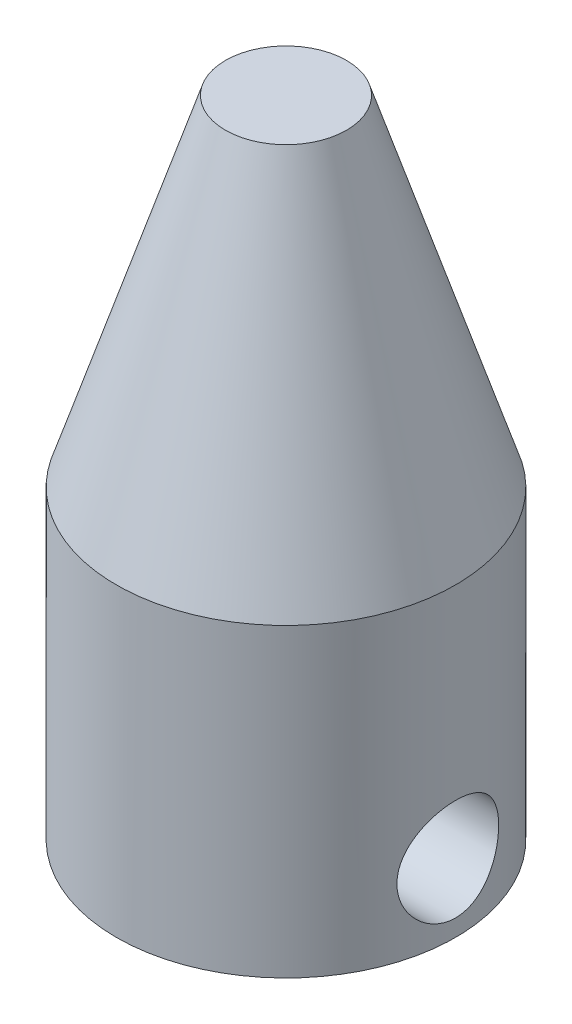
ISO-10303-21;
HEADER;
FILE_DESCRIPTION(('STEP AP214'),'2;1');
FILE_NAME('part.step','',(''),(''),'','','');
FILE_SCHEMA(('AUTOMOTIVE_DESIGN { 1 0 10303 214 1 1 1 1 }'));
ENDSEC;
DATA;
#1=APPLICATION_CONTEXT('core data for automotive mechanical design processes');
#2=APPLICATION_PROTOCOL_DEFINITION('international standard','automotive_design',2000,#1);
#3=PRODUCT_CONTEXT('',#1,'mechanical');
#4=PRODUCT('Part','Part','',(#3));
#5=PRODUCT_RELATED_PRODUCT_CATEGORY('part','',(#4));
#6=PRODUCT_DEFINITION_FORMATION('','',#4);
#7=PRODUCT_DEFINITION_CONTEXT('part definition',#1,'design');
#8=PRODUCT_DEFINITION('design','',#6,#7);
#9=PRODUCT_DEFINITION_SHAPE('','',#8);
#10=(LENGTH_UNIT() NAMED_UNIT(*) SI_UNIT(.MILLI.,.METRE.));
#11=(NAMED_UNIT(*) PLANE_ANGLE_UNIT() SI_UNIT($,.RADIAN.));
#12=(NAMED_UNIT(*) SI_UNIT($,.STERADIAN.) SOLID_ANGLE_UNIT());
#13=UNCERTAINTY_MEASURE_WITH_UNIT(LENGTH_MEASURE(1.E-05),#10,'distance_accuracy_value','');
#14=(GEOMETRIC_REPRESENTATION_CONTEXT(3) GLOBAL_UNCERTAINTY_ASSIGNED_CONTEXT((#13)) GLOBAL_UNIT_ASSIGNED_CONTEXT((#10,
#11,#12)) REPRESENTATION_CONTEXT('',''));
#15=CARTESIAN_POINT('',(0.,0.,0.));
#16=DIRECTION('',(0.,0.,1.));
#17=DIRECTION('',(1.,0.,0.));
#18=AXIS2_PLACEMENT_3D('',#15,#16,#17);
#19=CARTESIAN_POINT('',(0.,9.,0.));
#20=DIRECTION('',(0.,-1.,0.));
#21=DIRECTION('',(0.,0.,-1.));
#22=AXIS2_PLACEMENT_3D('',#19,#20,#21);
#23=CYLINDRICAL_SURFACE('',#22,5.);
#24=CARTESIAN_POINT('',(-5.,0.5,0.));
#25=CARTESIAN_POINT('',(-4.9999992925055,0.500000997484886,-0.0822886127533));
#26=CARTESIAN_POINT('',(-4.99794915693954,0.506793863623966,-0.164587318351529));
#27=CARTESIAN_POINT('',(-4.98997105593691,0.533721354222101,-0.326788125304881));
#28=CARTESIAN_POINT('',(-4.98404193389692,0.553859958023342,-0.40668950441142));
#29=CARTESIAN_POINT('',(-4.96895552501836,0.606746016910264,-0.561732707754527));
#30=CARTESIAN_POINT('',(-4.95980300250425,0.639474869618937,-0.636881364395373));
#31=CARTESIAN_POINT('',(-4.93922109237645,0.716536093055836,-0.780624181053131));
#32=CARTESIAN_POINT('',(-4.92779140192067,0.760870007395417,-0.84921746746967));
#33=CARTESIAN_POINT('',(-4.90350737192774,0.861224007472669,-0.979871797183745));
#34=CARTESIAN_POINT('',(-4.89062383657036,0.917516625885914,-1.04171807124434));
#35=CARTESIAN_POINT('',(-4.86505834210442,1.03960922991018,-1.15524920923324));
#36=CARTESIAN_POINT('',(-4.85237641724501,1.10541081212496,-1.20693236327441));
#37=CARTESIAN_POINT('',(-4.82834113993772,1.24647075303761,-1.29980037723708));
#38=CARTESIAN_POINT('',(-4.81702406663875,1.32190846099074,-1.34072309022213));
#39=CARTESIAN_POINT('',(-4.79743620394031,1.47898925423029,-1.4092139477476));
#40=CARTESIAN_POINT('',(-4.78916468313311,1.56063084392798,-1.43678529919973));
#41=CARTESIAN_POINT('',(-4.77690870838434,1.72539026613046,-1.47701633682652));
#42=CARTESIAN_POINT('',(-4.77281069324533,1.80840274386394,-1.49007196234677));
#43=CARTESIAN_POINT('',(-4.76902789749767,1.97553315621677,-1.50213730614672));
#44=CARTESIAN_POINT('',(-4.76934204760571,2.05965081805909,-1.50115042761078));
#45=CARTESIAN_POINT('',(-4.77424744067778,2.22338390860848,-1.48546977199812));
#46=CARTESIAN_POINT('',(-4.7786838859914,2.30305225036224,-1.47127205262685));
#47=CARTESIAN_POINT('',(-4.79108356228624,2.45881978627346,-1.43037420427056));
#48=CARTESIAN_POINT('',(-4.79904714132351,2.53491862737433,-1.40367284141641));
#49=CARTESIAN_POINT('',(-4.81772733074973,2.68260034966074,-1.33816026653682));
#50=CARTESIAN_POINT('',(-4.82848016115952,2.75410708395526,-1.29918816934642));
#51=CARTESIAN_POINT('',(-4.85150987000065,2.88973202201019,-1.21035222588683));
#52=CARTESIAN_POINT('',(-4.86378711746991,2.95384842941378,-1.16048574002588));
#53=CARTESIAN_POINT('',(-4.88911011297937,3.07568619076202,-1.04881290765546));
#54=CARTESIAN_POINT('',(-4.90216654310498,3.13302866402967,-0.986594907466972));
#55=CARTESIAN_POINT('',(-4.92712244063259,3.23655398406425,-0.853263259313967));
#56=CARTESIAN_POINT('',(-4.9390218351841,3.28273612841443,-0.782149051860888));
#57=CARTESIAN_POINT('',(-4.9604316006947,3.36285992246473,-0.632355038342803));
#58=CARTESIAN_POINT('',(-4.96992543668314,3.39671751624986,-0.55362774974795));
#59=CARTESIAN_POINT('',(-4.98533521832222,3.45059959009963,-0.39124541560352));
#60=CARTESIAN_POINT('',(-4.99125216186999,3.47062792853249,-0.307591751589582));
#61=CARTESIAN_POINT('',(-4.99868364643538,3.49565217789939,-0.140952242668332));
#62=CARTESIAN_POINT('',(-5.0003485041779,3.50116158580161,-0.0580500976011871));
#63=CARTESIAN_POINT('',(-4.9995292324176,3.49843084428792,0.107499605823383));
#64=CARTESIAN_POINT('',(-4.99704565677756,3.49019253034856,0.19014719669078));
#65=CARTESIAN_POINT('',(-4.98830696987163,3.4606153888885,0.350903605309697));
#66=CARTESIAN_POINT('',(-4.98213829799417,3.43957661241913,0.429072772614169));
#67=CARTESIAN_POINT('',(-4.96674347841533,3.3853567672218,0.580754638954522));
#68=CARTESIAN_POINT('',(-4.95751696321085,3.35217423896214,0.654266777025583));
#69=CARTESIAN_POINT('',(-4.93669654351325,3.27374683451887,0.796437189461052));
#70=CARTESIAN_POINT('',(-4.92505280829675,3.22824065905203,0.864943826199669));
#71=CARTESIAN_POINT('',(-4.90073468764318,3.12677524594719,0.993523307980147));
#72=CARTESIAN_POINT('',(-4.8880600443108,3.07081338811233,1.05359403235593));
#73=CARTESIAN_POINT('',(-4.86253171869138,2.94761269163066,1.16585744551027));
#74=CARTESIAN_POINT('',(-4.84968825033268,2.88003812422826,1.21768481231503));
#75=CARTESIAN_POINT('',(-4.82576515238464,2.73687206098647,1.30928995072154));
#76=CARTESIAN_POINT('',(-4.81468547654651,2.66128077544179,1.34906803829472));
#77=CARTESIAN_POINT('',(-4.79567189615055,2.50446750874531,1.41517347127168));
#78=CARTESIAN_POINT('',(-4.78772337843827,2.42327381346341,1.4415634693705));
#79=CARTESIAN_POINT('',(-4.77591594362794,2.25731203106852,1.48021730815114));
#80=CARTESIAN_POINT('',(-4.772055625083,2.17254517921233,1.49248598978779));
#81=CARTESIAN_POINT('',(-4.76899972496087,2.00563848162377,1.50221984485059));
#82=CARTESIAN_POINT('',(-4.76961647442754,1.92353634898242,1.5002805530849));
#83=CARTESIAN_POINT('',(-4.77499401288294,1.7608858966272,1.48307505444813));
#84=CARTESIAN_POINT('',(-4.77975463592551,1.68033751482365,1.46780938124716));
#85=CARTESIAN_POINT('',(-4.79275763670385,1.52405460085715,1.42476888804136));
#86=CARTESIAN_POINT('',(-4.80095604545965,1.44827271263831,1.39715175507068));
#87=CARTESIAN_POINT('',(-4.81990278909136,1.30235756118228,1.33031507121129));
#88=CARTESIAN_POINT('',(-4.83065161194312,1.23222538235924,1.29109329962876));
#89=CARTESIAN_POINT('',(-4.85397676425833,1.09683688347289,1.20048763805072));
#90=CARTESIAN_POINT('',(-4.86660540163798,1.03185123873959,1.14871276092994));
#91=CARTESIAN_POINT('',(-4.89201320450026,0.911297501692137,1.03517434629782));
#92=CARTESIAN_POINT('',(-4.90479240823905,0.855731860532243,0.973408217134502));
#93=CARTESIAN_POINT('',(-4.92950936570649,0.75397658770497,0.839465762183249));
#94=CARTESIAN_POINT('',(-4.94141159765674,0.708108553144511,0.767037885790608));
#95=CARTESIAN_POINT('',(-4.96260680455813,0.629264830095975,0.615141373983529));
#96=CARTESIAN_POINT('',(-4.97190099931067,0.596283111725492,0.535676052998955));
#97=CARTESIAN_POINT('',(-4.98602174969301,0.547104724347251,0.380757712655282));
#98=CARTESIAN_POINT('',(-4.99122027381068,0.529488327116752,0.305786961954234));
#99=CARTESIAN_POINT('',(-4.99820944494492,0.505936474758423,0.15388019523078));
#100=CARTESIAN_POINT('',(-5.0000006615474,0.499999067295181,0.0769445098581397));
#101=CARTESIAN_POINT('',(-5.,0.5,0.));
#102=B_SPLINE_CURVE_WITH_KNOTS('',3,(#24,#25,#26,#27,#28,#29,#30,#31,#32,#33,#34,#35,#36,#37,
#38,#39,#40,#41,#42,#43,#44,#45,#46,#47,#48,#49,#50,#51,#52,#53,#54,#55,#56,#57,#58,#59,#60,#61,
#62,#63,#64,#65,#66,#67,#68,#69,#70,#71,#72,#73,#74,#75,#76,#77,#78,#79,#80,#81,#82,#83,#84,#85,
#86,#87,#88,#89,#90,#91,#92,#93,#94,#95,#96,#97,#98,#99,#100,#101),.UNSPECIFIED.,.T.,.F.,(4,2,2,
2,2,2,2,2,2,2,2,2,2,2,2,2,2,2,2,2,2,2,2,2,2,2,2,2,2,2,2,2,2,2,2,2,2,2,4),(0.,0.246583203612611,
0.493239964846,0.739533676300874,0.985860164412702,1.23855602948191,1.49129437288633,
1.74971481004109,2.00807314543224,2.25919689356599,2.51025978319089,2.75226016697676,
2.99428443658001,3.23962426447119,3.48502360158555,3.74067104048166,3.99633456531071,
4.25371046881688,4.51101453528808,4.75908809438545,5.00712853550327,5.24956746682327,
5.49203554593728,5.74011305702908,5.98825282000191,6.24540400322818,6.5025484425268,
6.75847814951252,7.01432009460283,7.25950155466943,7.504673196616,7.74680040402721,
7.98897397553107,8.23996925679931,8.49102974897502,8.74942996156671,9.00770911595235,
9.23831691930459,9.46888616948874),.UNSPECIFIED.);
#103=CARTESIAN_POINT('',(-5.,0.5,0.));
#104=VERTEX_POINT('',#103);
#105=EDGE_CURVE('E11',#104,#104,#102,.T.);
#106=ORIENTED_EDGE('',*,*,#105,.T.);
#107=EDGE_LOOP('',(#106));
#108=FACE_BOUND('',#107,.T.);
#109=CARTESIAN_POINT('',(4.76969600708473,2.,-1.5));
#110=CARTESIAN_POINT('',(4.7696968572698,1.9178054520576,-1.49999897633764));
#111=CARTESIAN_POINT('',(4.77184390209069,1.83560077585598,-1.49322108167142));
#112=CARTESIAN_POINT('',(4.780165783029,1.67359475040806,-1.46635844446749));
#113=CARTESIAN_POINT('',(4.78634196493468,1.59379421349853,-1.44626925573578));
#114=CARTESIAN_POINT('',(4.80196102485632,1.43896527172827,-1.39352753269955));
#115=CARTESIAN_POINT('',(4.81139846703232,1.36392917036691,-1.36089589394243));
#116=CARTESIAN_POINT('',(4.83246932547567,1.2203780660047,-1.28406421917929));
#117=CARTESIAN_POINT('',(4.84410307041019,1.15186404131556,-1.23986245137053));
#118=CARTESIAN_POINT('',(4.86866862185765,1.02113360942262,-1.13964754141627));
#119=CARTESIAN_POINT('',(4.88162808311636,0.959154102053713,-1.08333207175807));
#120=CARTESIAN_POINT('',(4.90714861936757,0.845362048677491,-0.961136237579599));
#121=CARTESIAN_POINT('',(4.91970964297705,0.793550809550121,-0.895254645461111));
#122=CARTESIAN_POINT('',(4.94333214579389,0.700537300166693,-0.75411143779369));
#123=CARTESIAN_POINT('',(4.95435724342404,0.659576575557191,-0.678684021335815));
#124=CARTESIAN_POINT('',(4.97334435920684,0.591012740957243,-0.521624645369354));
#125=CARTESIAN_POINT('',(4.98130703789495,0.563406750142551,-0.439994028387912));
#126=CARTESIAN_POINT('',(4.99307646003589,0.523119998909491,-0.27532385263083));
#127=CARTESIAN_POINT('',(4.99699557369338,0.510034872347297,-0.192391398953801));
#128=CARTESIAN_POINT('',(5.00063201501348,0.497882675353559,-0.025421823749315));
#129=CARTESIAN_POINT('',(5.00035022521079,0.498812660598037,0.0586150620503682));
#130=CARTESIAN_POINT('',(4.99569603817659,0.514392868543023,0.22257115660016));
#131=CARTESIAN_POINT('',(4.9914542020526,0.528605193809869,0.302536267641341));
#132=CARTESIAN_POINT('',(4.97951522112593,0.56963133599429,0.458889213442527));
#133=CARTESIAN_POINT('',(4.97181785750586,0.596445950942671,0.535276821322846));
#134=CARTESIAN_POINT('',(4.95365220986963,0.662212023418558,0.683347326351281));
#135=CARTESIAN_POINT('',(4.94315269676706,0.701301202807267,0.754965064694478));
#136=CARTESIAN_POINT('',(4.92049640648069,0.790397852428228,0.890764673783156));
#137=CARTESIAN_POINT('',(4.90833923637778,0.840407912963484,0.954944774872131));
#138=CARTESIAN_POINT('',(4.88311550488165,0.952197750751597,1.0766604815298));
#139=CARTESIAN_POINT('',(4.87003195321461,1.01435691902974,1.13384458040111));
#140=CARTESIAN_POINT('',(4.84483979887497,1.14751001789005,1.23707651539824));
#141=CARTESIAN_POINT('',(4.8327312931702,1.21850482538923,1.28312324482853));
#142=CARTESIAN_POINT('',(4.81077903197678,1.36823946924899,1.3631399533545));
#143=CARTESIAN_POINT('',(4.80095810695957,1.44704704586292,1.39698989237679));
#144=CARTESIAN_POINT('',(4.78496392548436,1.60960720844554,1.45083362878413));
#145=CARTESIAN_POINT('',(4.7787894791583,1.69335817153456,1.4708319464056));
#146=CARTESIAN_POINT('',(4.77104849541241,1.86008236073928,1.49574770282165));
#147=CARTESIAN_POINT('',(4.7693187867044,1.94296822389398,1.50119946380212));
#148=CARTESIAN_POINT('',(4.77021192441924,2.10847290000987,1.49835947233062));
#149=CARTESIAN_POINT('',(4.77283416156589,2.19109174873085,1.4900696437133));
#150=CARTESIAN_POINT('',(4.78197558554912,2.35148837797087,1.4604576357419));
#151=CARTESIAN_POINT('',(4.78839176507489,2.42933616426352,1.4394796143128));
#152=CARTESIAN_POINT('',(4.80429141231227,2.58040169081492,1.3854857774794));
#153=CARTESIAN_POINT('',(4.81377535359073,2.65361871414057,1.3524681034276));
#154=CARTESIAN_POINT('',(4.83505835023047,2.79551746407213,1.274318711965));
#155=CARTESIAN_POINT('',(4.84691271069799,2.86402472098579,1.22888564172729));
#156=CARTESIAN_POINT('',(4.87148205646987,2.9926381061808,1.12755301600385));
#157=CARTESIAN_POINT('',(4.88419724730003,3.05274221761279,1.07165095534897));
#158=CARTESIAN_POINT('',(4.90963633548158,3.16518040581474,0.948455132493599));
#159=CARTESIAN_POINT('',(4.92234245063004,3.21713562898698,0.880811065857434));
#160=CARTESIAN_POINT('',(4.94584851748651,3.30896670102775,0.737461784590249));
#161=CARTESIAN_POINT('',(4.95664856384717,3.34884314978146,0.661756970543944));
#162=CARTESIAN_POINT('',(4.97505970474957,3.4150000305683,0.504935504705222));
#163=CARTESIAN_POINT('',(4.98269453424966,3.44138201615898,0.423864622037839));
#164=CARTESIAN_POINT('',(4.99401979596827,3.48006091889042,0.258169966504588));
#165=CARTESIAN_POINT('',(4.9977113567088,3.49236186594842,0.173547217354763));
#166=CARTESIAN_POINT('',(5.00066544081399,3.5022230440545,0.00665215388274265));
#167=CARTESIAN_POINT('',(5.00009305111322,3.50033269540783,-0.0755851790862068));
#168=CARTESIAN_POINT('',(4.99497264465037,3.48317836750088,-0.238519481164404));
#169=CARTESIAN_POINT('',(4.99042485330462,3.46791514651956,-0.319216537346529));
#170=CARTESIAN_POINT('',(4.97791168358327,3.42478833860038,-0.475935813041358));
#171=CARTESIAN_POINT('',(4.96998352900866,3.39706181935099,-0.551998927351392));
#172=CARTESIAN_POINT('',(4.9515294303945,3.32991808549281,-0.698433237752053));
#173=CARTESIAN_POINT('',(4.94100305949946,3.29049894971381,-0.76880349605058));
#174=CARTESIAN_POINT('',(4.91803965828228,3.19962654256996,-0.904301892420563));
#175=CARTESIAN_POINT('',(4.90555226923559,3.14782856999923,-0.969190250076767));
#176=CARTESIAN_POINT('',(4.88023537212334,3.0342896116672,-1.08953757134594));
#177=CARTESIAN_POINT('',(4.86740576641079,2.97254576210185,-1.14499380960194));
#178=CARTESIAN_POINT('',(4.84240680631319,2.83865922168949,-1.24656269394549));
#179=CARTESIAN_POINT('',(4.83026852693485,2.76626144660956,-1.29234759757956));
#180=CARTESIAN_POINT('',(4.80852547508793,2.61444482583898,-1.37104313528776));
#181=CARTESIAN_POINT('',(4.79891948596956,2.53502937639881,-1.40395995557289));
#182=CARTESIAN_POINT('',(4.78427816717594,2.38025956839373,-1.4530194253295));
#183=CARTESIAN_POINT('',(4.7788615484052,2.30539135306901,-1.47058859011232));
#184=CARTESIAN_POINT('',(4.77157042597167,2.15368477750423,-1.49407818835144));
#185=CARTESIAN_POINT('',(4.7696952122143,2.07684681535475,-1.50000095706095));
#186=CARTESIAN_POINT('',(4.76969600708473,2.,-1.5));
#187=B_SPLINE_CURVE_WITH_KNOTS('',3,(#109,#110,#111,#112,#113,#114,#115,#116,#117,#118,#119,
#120,#121,#122,#123,#124,#125,#126,#127,#128,#129,#130,#131,#132,#133,#134,#135,#136,#137,#138,
#139,#140,#141,#142,#143,#144,#145,#146,#147,#148,#149,#150,#151,#152,#153,#154,#155,#156,#157,
#158,#159,#160,#161,#162,#163,#164,#165,#166,#167,#168,#169,#170,#171,#172,#173,#174,#175,#176,
#177,#178,#179,#180,#181,#182,#183,#184,#185,#186),.UNSPECIFIED.,.T.,.F.,(4,2,2,2,2,2,2,2,2,2,2,
2,2,2,2,2,2,2,2,2,2,2,2,2,2,2,2,2,2,2,2,2,2,2,2,2,2,2,4),(0.,0.246300165915542,0.492682641689,
0.738656414466193,0.984667025370101,1.23773150007984,1.49082847871273,1.74915939273645,
2.00743455587877,2.25832140149558,2.5091555410144,2.7520012599088,2.99486235890376,
3.24055209335676,3.4863001659083,3.74152147023278,3.99676812491863,4.25446238246266,
4.51207250628411,4.76008080790309,5.00805439107388,5.24958594938817,5.49115481045787,
5.73920731809388,5.98731925928923,6.24479506100602,6.50225807324202,6.75775391814325,
7.01317662321682,7.2587630391122,7.50433553047755,7.74727096872219,7.99024634491378,
8.24099627054488,8.4918185262989,8.75011639669147,9.00828993963944,9.23861153857447,
9.4688869503356),.UNSPECIFIED.);
#188=CARTESIAN_POINT('',(4.76969600708473,2.,-1.5));
#189=VERTEX_POINT('',#188);
#190=EDGE_CURVE('E41',#189,#189,#187,.T.);
#191=ORIENTED_EDGE('',*,*,#190,.T.);
#192=EDGE_LOOP('',(#191));
#193=FACE_BOUND('',#192,.T.);
#194=CARTESIAN_POINT('',(0.,9.,0.));
#195=DIRECTION('',(0.,-1.,0.));
#196=DIRECTION('',(0.,0.,-1.));
#197=AXIS2_PLACEMENT_3D('',#194,#195,#196);
#198=CIRCLE('',#197,5.);
#199=CARTESIAN_POINT('',(0.,9.,-5.));
#200=VERTEX_POINT('',#199);
#201=EDGE_CURVE('E46',#200,#200,#198,.F.);
#202=ORIENTED_EDGE('',*,*,#201,.F.);
#203=EDGE_LOOP('',(#202));
#204=FACE_BOUND('',#203,.T.);
#205=CARTESIAN_POINT('',(0.,0.,0.));
#206=DIRECTION('',(0.,1.,0.));
#207=DIRECTION('',(0.,0.,1.));
#208=AXIS2_PLACEMENT_3D('',#205,#206,#207);
#209=CIRCLE('',#208,5.);
#210=CARTESIAN_POINT('',(0.,0.,5.));
#211=VERTEX_POINT('',#210);
#212=EDGE_CURVE('E72',#211,#211,#209,.T.);
#213=ORIENTED_EDGE('',*,*,#212,.T.);
#214=EDGE_LOOP('',(#213));
#215=FACE_BOUND('',#214,.T.);
#216=ADVANCED_FACE('F33',(#108,#193,#204,#215),#23,.T.);
#217=CARTESIAN_POINT('',(0.,0.,0.));
#218=DIRECTION('',(0.,1.,0.));
#219=DIRECTION('',(0.,0.,1.));
#220=AXIS2_PLACEMENT_3D('',#217,#218,#219);
#221=PLANE('',#220);
#222=ORIENTED_EDGE('',*,*,#212,.F.);
#223=EDGE_LOOP('',(#222));
#224=FACE_BOUND('',#223,.T.);
#225=ADVANCED_FACE('F59',(#224),#221,.F.);
#226=CARTESIAN_POINT('',(-5.,2.,0.));
#227=DIRECTION('',(1.,0.,0.));
#228=DIRECTION('',(0.,0.,-1.));
#229=AXIS2_PLACEMENT_3D('',#226,#227,#228);
#230=CYLINDRICAL_SURFACE('',#229,1.5);
#231=ORIENTED_EDGE('',*,*,#190,.F.);
#232=EDGE_LOOP('',(#231));
#233=FACE_BOUND('',#232,.T.);
#234=ORIENTED_EDGE('',*,*,#105,.F.);
#235=EDGE_LOOP('',(#234));
#236=FACE_BOUND('',#235,.T.);
#237=ADVANCED_FACE('F54',(#233,#236),#230,.F.);
#238=CARTESIAN_POINT('',(0.,19.,0.));
#239=DIRECTION('',(0.,1.,0.));
#240=DIRECTION('',(0.,0.,1.));
#241=AXIS2_PLACEMENT_3D('',#238,#239,#240);
#242=PLANE('',#241);
#243=CARTESIAN_POINT('',(0.,19.,0.));
#244=DIRECTION('',(0.,1.,0.));
#245=DIRECTION('',(0.,0.,1.));
#246=AXIS2_PLACEMENT_3D('',#243,#244,#245);
#247=CIRCLE('',#246,1.784);
#248=CARTESIAN_POINT('',(0.,19.,1.784));
#249=VERTEX_POINT('',#248);
#250=EDGE_CURVE('E74',#249,#249,#247,.T.);
#251=ORIENTED_EDGE('',*,*,#250,.T.);
#252=EDGE_LOOP('',(#251));
#253=FACE_BOUND('',#252,.T.);
#254=ADVANCED_FACE('F58',(#253),#242,.T.);
#255=CARTESIAN_POINT('',(0.,19.,0.));
#256=DIRECTION('',(0.,-1.,0.));
#257=DIRECTION('',(0.,0.,-1.));
#258=AXIS2_PLACEMENT_3D('',#255,#256,#257);
#259=CONICAL_SURFACE('',#258,1.784,0.311153648567417);
#260=ORIENTED_EDGE('',*,*,#250,.F.);
#261=EDGE_LOOP('',(#260));
#262=FACE_BOUND('',#261,.T.);
#263=ORIENTED_EDGE('',*,*,#201,.T.);
#264=EDGE_LOOP('',(#263));
#265=FACE_BOUND('',#264,.T.);
#266=ADVANCED_FACE('F61',(#262,#265),#259,.T.);
#267=CLOSED_SHELL('',(#216,#225,#237,#254,#266));
#268=MANIFOLD_SOLID_BREP('B2',#267);
#269=ADVANCED_BREP_SHAPE_REPRESENTATION('',(#18,#268),#14);
#270=SHAPE_DEFINITION_REPRESENTATION(#9,#269);
ENDSEC;
END-ISO-10303-21;
